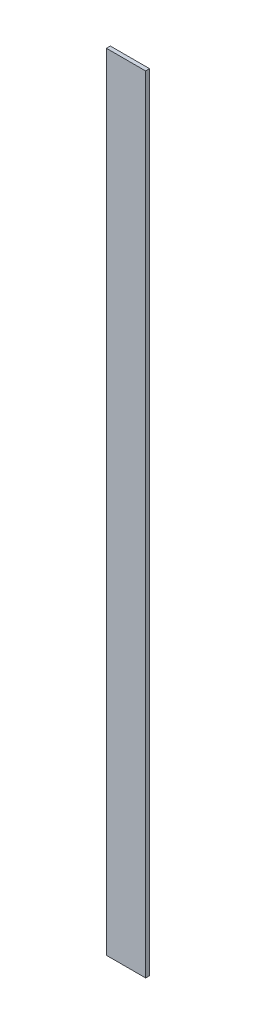
ISO-10303-21;
HEADER;
FILE_DESCRIPTION(('STEP AP214'),'2;1');
FILE_NAME('part.step','',(''),(''),'','','');
FILE_SCHEMA(('AUTOMOTIVE_DESIGN { 1 0 10303 214 1 1 1 1 }'));
ENDSEC;
DATA;
#1=APPLICATION_CONTEXT('core data for automotive mechanical design processes');
#2=APPLICATION_PROTOCOL_DEFINITION('international standard','automotive_design',2000,#1);
#3=PRODUCT_CONTEXT('',#1,'mechanical');
#4=PRODUCT('Part','Part','',(#3));
#5=PRODUCT_RELATED_PRODUCT_CATEGORY('part','',(#4));
#6=PRODUCT_DEFINITION_FORMATION('','',#4);
#7=PRODUCT_DEFINITION_CONTEXT('part definition',#1,'design');
#8=PRODUCT_DEFINITION('design','',#6,#7);
#9=PRODUCT_DEFINITION_SHAPE('','',#8);
#10=(LENGTH_UNIT() NAMED_UNIT(*) SI_UNIT(.MILLI.,.METRE.));
#11=(NAMED_UNIT(*) PLANE_ANGLE_UNIT() SI_UNIT($,.RADIAN.));
#12=(NAMED_UNIT(*) SI_UNIT($,.STERADIAN.) SOLID_ANGLE_UNIT());
#13=UNCERTAINTY_MEASURE_WITH_UNIT(LENGTH_MEASURE(1.E-05),#10,'distance_accuracy_value','');
#14=(GEOMETRIC_REPRESENTATION_CONTEXT(3) GLOBAL_UNCERTAINTY_ASSIGNED_CONTEXT((#13)) GLOBAL_UNIT_ASSIGNED_CONTEXT((#10,
#11,#12)) REPRESENTATION_CONTEXT('',''));
#15=CARTESIAN_POINT('',(0.,0.,0.));
#16=DIRECTION('',(0.,0.,1.));
#17=DIRECTION('',(1.,0.,0.));
#18=AXIS2_PLACEMENT_3D('',#15,#16,#17);
#19=CARTESIAN_POINT('',(0.,0.,6.));
#20=DIRECTION('',(1.,0.,0.));
#21=DIRECTION('',(0.,0.,-1.));
#22=AXIS2_PLACEMENT_3D('',#19,#20,#21);
#23=PLANE('',#22);
#24=DIRECTION('',(0.,-1.,0.));
#25=VECTOR('',#24,1.);
#26=CARTESIAN_POINT('',(0.,0.,0.));
#27=LINE('',#26,#25);
#28=CARTESIAN_POINT('',(0.,1200.,0.));
#29=VERTEX_POINT('',#28);
#30=CARTESIAN_POINT('',(0.,0.,0.));
#31=VERTEX_POINT('',#30);
#32=EDGE_CURVE('E108',#29,#31,#27,.T.);
#33=ORIENTED_EDGE('',*,*,#32,.T.);
#34=DIRECTION('',(0.,0.,-1.));
#35=VECTOR('',#34,1.);
#36=CARTESIAN_POINT('',(0.,0.,6.));
#37=LINE('',#36,#35);
#38=CARTESIAN_POINT('',(0.,0.,6.));
#39=VERTEX_POINT('',#38);
#40=EDGE_CURVE('E11',#39,#31,#37,.T.);
#41=ORIENTED_EDGE('',*,*,#40,.F.);
#42=DIRECTION('',(0.,-1.,0.));
#43=VECTOR('',#42,1.);
#44=CARTESIAN_POINT('',(0.,0.,6.));
#45=LINE('',#44,#43);
#46=CARTESIAN_POINT('',(0.,1200.,6.));
#47=VERTEX_POINT('',#46);
#48=EDGE_CURVE('E92',#47,#39,#45,.T.);
#49=ORIENTED_EDGE('',*,*,#48,.F.);
#50=DIRECTION('',(0.,0.,-1.));
#51=VECTOR('',#50,1.);
#52=CARTESIAN_POINT('',(0.,1200.,6.));
#53=LINE('',#52,#51);
#54=EDGE_CURVE('E105',#47,#29,#53,.T.);
#55=ORIENTED_EDGE('',*,*,#54,.T.);
#56=EDGE_LOOP('',(#33,#41,#49,#55));
#57=FACE_BOUND('',#56,.T.);
#58=ADVANCED_FACE('F43',(#57),#23,.F.);
#59=CARTESIAN_POINT('',(0.,0.,6.));
#60=DIRECTION('',(0.,1.,0.));
#61=DIRECTION('',(0.,0.,1.));
#62=AXIS2_PLACEMENT_3D('',#59,#60,#61);
#63=PLANE('',#62);
#64=DIRECTION('',(1.,0.,0.));
#65=VECTOR('',#64,1.);
#66=CARTESIAN_POINT('',(0.,0.,0.));
#67=LINE('',#66,#65);
#68=CARTESIAN_POINT('',(60.,0.,0.));
#69=VERTEX_POINT('',#68);
#70=EDGE_CURVE('E97',#31,#69,#67,.T.);
#71=ORIENTED_EDGE('',*,*,#70,.T.);
#72=DIRECTION('',(0.,0.,-1.));
#73=VECTOR('',#72,1.);
#74=CARTESIAN_POINT('',(60.,0.,6.));
#75=LINE('',#74,#73);
#76=CARTESIAN_POINT('',(60.,0.,6.));
#77=VERTEX_POINT('',#76);
#78=EDGE_CURVE('E51',#77,#69,#75,.T.);
#79=ORIENTED_EDGE('',*,*,#78,.F.);
#80=DIRECTION('',(1.,0.,0.));
#81=VECTOR('',#80,1.);
#82=CARTESIAN_POINT('',(0.,0.,6.));
#83=LINE('',#82,#81);
#84=EDGE_CURVE('E87',#39,#77,#83,.T.);
#85=ORIENTED_EDGE('',*,*,#84,.F.);
#86=ORIENTED_EDGE('',*,*,#40,.T.);
#87=EDGE_LOOP('',(#71,#79,#85,#86));
#88=FACE_BOUND('',#87,.T.);
#89=ADVANCED_FACE('F100',(#88),#63,.F.);
#90=CARTESIAN_POINT('',(60.,0.,6.));
#91=DIRECTION('',(-1.,0.,0.));
#92=DIRECTION('',(0.,0.,1.));
#93=AXIS2_PLACEMENT_3D('',#90,#91,#92);
#94=PLANE('',#93);
#95=DIRECTION('',(0.,1.,0.));
#96=VECTOR('',#95,1.);
#97=CARTESIAN_POINT('',(60.,0.,0.));
#98=LINE('',#97,#96);
#99=CARTESIAN_POINT('',(60.,1200.,0.));
#100=VERTEX_POINT('',#99);
#101=EDGE_CURVE('E78',#69,#100,#98,.T.);
#102=ORIENTED_EDGE('',*,*,#101,.T.);
#103=DIRECTION('',(0.,0.,-1.));
#104=VECTOR('',#103,1.);
#105=CARTESIAN_POINT('',(60.,1200.,6.));
#106=LINE('',#105,#104);
#107=CARTESIAN_POINT('',(60.,1200.,6.));
#108=VERTEX_POINT('',#107);
#109=EDGE_CURVE('E98',#108,#100,#106,.T.);
#110=ORIENTED_EDGE('',*,*,#109,.F.);
#111=DIRECTION('',(0.,1.,0.));
#112=VECTOR('',#111,1.);
#113=CARTESIAN_POINT('',(60.,0.,6.));
#114=LINE('',#113,#112);
#115=EDGE_CURVE('E95',#77,#108,#114,.T.);
#116=ORIENTED_EDGE('',*,*,#115,.F.);
#117=ORIENTED_EDGE('',*,*,#78,.T.);
#118=EDGE_LOOP('',(#102,#110,#116,#117));
#119=FACE_BOUND('',#118,.T.);
#120=ADVANCED_FACE('F99',(#119),#94,.F.);
#121=CARTESIAN_POINT('',(0.,1200.,6.));
#122=DIRECTION('',(0.,-1.,0.));
#123=DIRECTION('',(0.,0.,-1.));
#124=AXIS2_PLACEMENT_3D('',#121,#122,#123);
#125=PLANE('',#124);
#126=DIRECTION('',(-1.,0.,0.));
#127=VECTOR('',#126,1.);
#128=CARTESIAN_POINT('',(0.,1200.,0.));
#129=LINE('',#128,#127);
#130=EDGE_CURVE('E85',#100,#29,#129,.T.);
#131=ORIENTED_EDGE('',*,*,#130,.T.);
#132=ORIENTED_EDGE('',*,*,#54,.F.);
#133=DIRECTION('',(-1.,0.,0.));
#134=VECTOR('',#133,1.);
#135=CARTESIAN_POINT('',(0.,1200.,6.));
#136=LINE('',#135,#134);
#137=EDGE_CURVE('E56',#108,#47,#136,.T.);
#138=ORIENTED_EDGE('',*,*,#137,.F.);
#139=ORIENTED_EDGE('',*,*,#109,.T.);
#140=EDGE_LOOP('',(#131,#132,#138,#139));
#141=FACE_BOUND('',#140,.T.);
#142=ADVANCED_FACE('F111',(#141),#125,.F.);
#143=CARTESIAN_POINT('',(0.,0.,6.));
#144=DIRECTION('',(0.,0.,-1.));
#145=DIRECTION('',(-1.,0.,0.));
#146=AXIS2_PLACEMENT_3D('',#143,#144,#145);
#147=PLANE('',#146);
#148=ORIENTED_EDGE('',*,*,#48,.T.);
#149=ORIENTED_EDGE('',*,*,#84,.T.);
#150=ORIENTED_EDGE('',*,*,#115,.T.);
#151=ORIENTED_EDGE('',*,*,#137,.T.);
#152=EDGE_LOOP('',(#148,#149,#150,#151));
#153=FACE_BOUND('',#152,.T.);
#154=ADVANCED_FACE('F89',(#153),#147,.F.);
#155=CARTESIAN_POINT('',(0.,0.,0.));
#156=DIRECTION('',(0.,0.,-1.));
#157=DIRECTION('',(-1.,0.,0.));
#158=AXIS2_PLACEMENT_3D('',#155,#156,#157);
#159=PLANE('',#158);
#160=ORIENTED_EDGE('',*,*,#32,.F.);
#161=ORIENTED_EDGE('',*,*,#130,.F.);
#162=ORIENTED_EDGE('',*,*,#101,.F.);
#163=ORIENTED_EDGE('',*,*,#70,.F.);
#164=EDGE_LOOP('',(#160,#161,#162,#163));
#165=FACE_BOUND('',#164,.T.);
#166=ADVANCED_FACE('F118',(#165),#159,.T.);
#167=CLOSED_SHELL('',(#58,#89,#120,#142,#154,#166));
#168=MANIFOLD_SOLID_BREP('B2',#167);
#169=ADVANCED_BREP_SHAPE_REPRESENTATION('',(#18,#168),#14);
#170=SHAPE_DEFINITION_REPRESENTATION(#9,#169);
ENDSEC;
END-ISO-10303-21;
